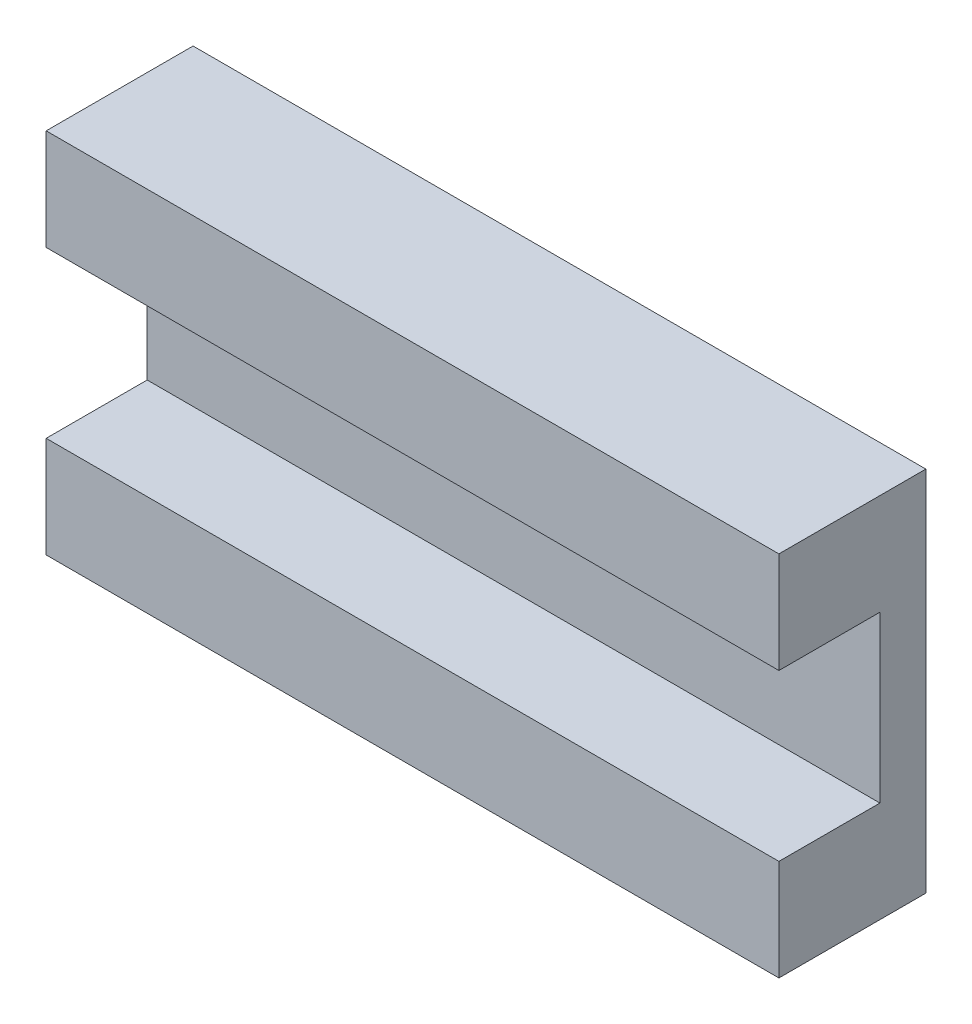
ISO-10303-21;
HEADER;
FILE_DESCRIPTION(('STEP AP214'),'2;1');
FILE_NAME('part.step','',(''),(''),'','','');
FILE_SCHEMA(('AUTOMOTIVE_DESIGN { 1 0 10303 214 1 1 1 1 }'));
ENDSEC;
DATA;
#1=APPLICATION_CONTEXT('core data for automotive mechanical design processes');
#2=APPLICATION_PROTOCOL_DEFINITION('international standard','automotive_design',2000,#1);
#3=PRODUCT_CONTEXT('',#1,'mechanical');
#4=PRODUCT('Part','Part','',(#3));
#5=PRODUCT_RELATED_PRODUCT_CATEGORY('part','',(#4));
#6=PRODUCT_DEFINITION_FORMATION('','',#4);
#7=PRODUCT_DEFINITION_CONTEXT('part definition',#1,'design');
#8=PRODUCT_DEFINITION('design','',#6,#7);
#9=PRODUCT_DEFINITION_SHAPE('','',#8);
#10=(LENGTH_UNIT() NAMED_UNIT(*) SI_UNIT(.MILLI.,.METRE.));
#11=(NAMED_UNIT(*) PLANE_ANGLE_UNIT() SI_UNIT($,.RADIAN.));
#12=(NAMED_UNIT(*) SI_UNIT($,.STERADIAN.) SOLID_ANGLE_UNIT());
#13=UNCERTAINTY_MEASURE_WITH_UNIT(LENGTH_MEASURE(1.E-05),#10,'distance_accuracy_value','');
#14=(GEOMETRIC_REPRESENTATION_CONTEXT(3) GLOBAL_UNCERTAINTY_ASSIGNED_CONTEXT((#13)) GLOBAL_UNIT_ASSIGNED_CONTEXT((#10,
#11,#12)) REPRESENTATION_CONTEXT('',''));
#15=CARTESIAN_POINT('',(0.,0.,0.));
#16=DIRECTION('',(0.,0.,1.));
#17=DIRECTION('',(1.,0.,0.));
#18=AXIS2_PLACEMENT_3D('',#15,#16,#17);
#19=CARTESIAN_POINT('',(0.,0.,8.));
#20=DIRECTION('',(0.,0.,1.));
#21=DIRECTION('',(1.,0.,0.));
#22=AXIS2_PLACEMENT_3D('',#19,#20,#21);
#23=PLANE('',#22);
#24=DIRECTION('',(1.,0.,0.));
#25=VECTOR('',#24,1.);
#26=CARTESIAN_POINT('',(-39.9,14.5,8.));
#27=LINE('',#26,#25);
#28=CARTESIAN_POINT('',(-39.9,14.5,8.));
#29=VERTEX_POINT('',#28);
#30=CARTESIAN_POINT('',(0.,14.5,8.));
#31=VERTEX_POINT('',#30);
#32=EDGE_CURVE('E137',#29,#31,#27,.T.);
#33=ORIENTED_EDGE('',*,*,#32,.T.);
#34=DIRECTION('',(0.,1.,0.));
#35=VECTOR('',#34,1.);
#36=CARTESIAN_POINT('',(0.,0.,8.));
#37=LINE('',#36,#35);
#38=CARTESIAN_POINT('',(0.,20.,8.));
#39=VERTEX_POINT('',#38);
#40=EDGE_CURVE('E85',#31,#39,#37,.T.);
#41=ORIENTED_EDGE('',*,*,#40,.T.);
#42=DIRECTION('',(-1.,0.,0.));
#43=VECTOR('',#42,1.);
#44=CARTESIAN_POINT('',(0.,20.,8.));
#45=LINE('',#44,#43);
#46=CARTESIAN_POINT('',(-39.9,20.,8.));
#47=VERTEX_POINT('',#46);
#48=EDGE_CURVE('E168',#39,#47,#45,.T.);
#49=ORIENTED_EDGE('',*,*,#48,.T.);
#50=DIRECTION('',(0.,-1.,0.));
#51=VECTOR('',#50,1.);
#52=CARTESIAN_POINT('',(-39.9,0.,8.));
#53=LINE('',#52,#51);
#54=EDGE_CURVE('E170',#47,#29,#53,.T.);
#55=ORIENTED_EDGE('',*,*,#54,.T.);
#56=EDGE_LOOP('',(#33,#41,#49,#55));
#57=FACE_BOUND('',#56,.T.);
#58=ADVANCED_FACE('F32',(#57),#23,.T.);
#59=CARTESIAN_POINT('',(0.,0.,8.));
#60=DIRECTION('',(-1.,0.,0.));
#61=DIRECTION('',(0.,0.,1.));
#62=AXIS2_PLACEMENT_3D('',#59,#60,#61);
#63=PLANE('',#62);
#64=ORIENTED_EDGE('',*,*,#40,.F.);
#65=DIRECTION('',(0.,0.,1.));
#66=VECTOR('',#65,1.);
#67=CARTESIAN_POINT('',(0.,14.5,8.));
#68=LINE('',#67,#66);
#69=CARTESIAN_POINT('',(0.,14.5,2.5));
#70=VERTEX_POINT('',#69);
#71=EDGE_CURVE('E129',#70,#31,#68,.T.);
#72=ORIENTED_EDGE('',*,*,#71,.F.);
#73=DIRECTION('',(0.,1.,0.));
#74=VECTOR('',#73,1.);
#75=CARTESIAN_POINT('',(0.,14.5,2.5));
#76=LINE('',#75,#74);
#77=CARTESIAN_POINT('',(0.,5.5,2.5));
#78=VERTEX_POINT('',#77);
#79=EDGE_CURVE('E131',#78,#70,#76,.T.);
#80=ORIENTED_EDGE('',*,*,#79,.F.);
#81=DIRECTION('',(0.,0.,-1.));
#82=VECTOR('',#81,1.);
#83=CARTESIAN_POINT('',(0.,5.5,8.));
#84=LINE('',#83,#82);
#85=CARTESIAN_POINT('',(0.,5.5,8.));
#86=VERTEX_POINT('',#85);
#87=EDGE_CURVE('E110',#86,#78,#84,.T.);
#88=ORIENTED_EDGE('',*,*,#87,.F.);
#89=CARTESIAN_POINT('',(0.,0.,8.));
#90=VERTEX_POINT('',#89);
#91=EDGE_CURVE('E166',#90,#86,#37,.T.);
#92=ORIENTED_EDGE('',*,*,#91,.F.);
#93=DIRECTION('',(0.,0.,-1.));
#94=VECTOR('',#93,1.);
#95=CARTESIAN_POINT('',(0.,0.,8.));
#96=LINE('',#95,#94);
#97=CARTESIAN_POINT('',(0.,0.,0.));
#98=VERTEX_POINT('',#97);
#99=EDGE_CURVE('E174',#90,#98,#96,.T.);
#100=ORIENTED_EDGE('',*,*,#99,.T.);
#101=DIRECTION('',(0.,1.,0.));
#102=VECTOR('',#101,1.);
#103=CARTESIAN_POINT('',(0.,0.,0.));
#104=LINE('',#103,#102);
#105=CARTESIAN_POINT('',(0.,20.,0.));
#106=VERTEX_POINT('',#105);
#107=EDGE_CURVE('E163',#98,#106,#104,.T.);
#108=ORIENTED_EDGE('',*,*,#107,.T.);
#109=DIRECTION('',(0.,0.,-1.));
#110=VECTOR('',#109,1.);
#111=CARTESIAN_POINT('',(0.,20.,8.));
#112=LINE('',#111,#110);
#113=EDGE_CURVE('E11',#39,#106,#112,.T.);
#114=ORIENTED_EDGE('',*,*,#113,.F.);
#115=EDGE_LOOP('',(#64,#72,#80,#88,#92,#100,#108,#114));
#116=FACE_BOUND('',#115,.T.);
#117=ADVANCED_FACE('F34',(#116),#63,.F.);
#118=CARTESIAN_POINT('',(0.,20.,8.));
#119=DIRECTION('',(0.,-1.,0.));
#120=DIRECTION('',(1.,0.,0.));
#121=AXIS2_PLACEMENT_3D('',#118,#119,#120);
#122=PLANE('',#121);
#123=DIRECTION('',(-1.,0.,0.));
#124=VECTOR('',#123,1.);
#125=CARTESIAN_POINT('',(0.,20.,0.));
#126=LINE('',#125,#124);
#127=CARTESIAN_POINT('',(-39.9,20.,0.));
#128=VERTEX_POINT('',#127);
#129=EDGE_CURVE('E177',#106,#128,#126,.T.);
#130=ORIENTED_EDGE('',*,*,#129,.T.);
#131=DIRECTION('',(0.,0.,-1.));
#132=VECTOR('',#131,1.);
#133=CARTESIAN_POINT('',(-39.9,20.,8.));
#134=LINE('',#133,#132);
#135=EDGE_CURVE('E40',#47,#128,#134,.T.);
#136=ORIENTED_EDGE('',*,*,#135,.F.);
#137=ORIENTED_EDGE('',*,*,#48,.F.);
#138=ORIENTED_EDGE('',*,*,#113,.T.);
#139=EDGE_LOOP('',(#130,#136,#137,#138));
#140=FACE_BOUND('',#139,.T.);
#141=ADVANCED_FACE('F204',(#140),#122,.F.);
#142=CARTESIAN_POINT('',(-39.9,0.,8.));
#143=DIRECTION('',(1.,0.,0.));
#144=DIRECTION('',(0.,0.,-1.));
#145=AXIS2_PLACEMENT_3D('',#142,#143,#144);
#146=PLANE('',#145);
#147=DIRECTION('',(0.,1.,0.));
#148=VECTOR('',#147,1.);
#149=CARTESIAN_POINT('',(-39.9,14.5,2.5));
#150=LINE('',#149,#148);
#151=CARTESIAN_POINT('',(-39.9,5.5,2.5));
#152=VERTEX_POINT('',#151);
#153=CARTESIAN_POINT('',(-39.9,14.5,2.5));
#154=VERTEX_POINT('',#153);
#155=EDGE_CURVE('E118',#152,#154,#150,.T.);
#156=ORIENTED_EDGE('',*,*,#155,.T.);
#157=DIRECTION('',(0.,0.,1.));
#158=VECTOR('',#157,1.);
#159=CARTESIAN_POINT('',(-39.9,14.5,8.));
#160=LINE('',#159,#158);
#161=EDGE_CURVE('E123',#154,#29,#160,.T.);
#162=ORIENTED_EDGE('',*,*,#161,.T.);
#163=ORIENTED_EDGE('',*,*,#54,.F.);
#164=ORIENTED_EDGE('',*,*,#135,.T.);
#165=DIRECTION('',(0.,-1.,0.));
#166=VECTOR('',#165,1.);
#167=CARTESIAN_POINT('',(-39.9,0.,0.));
#168=LINE('',#167,#166);
#169=CARTESIAN_POINT('',(-39.9,0.,0.));
#170=VERTEX_POINT('',#169);
#171=EDGE_CURVE('E179',#128,#170,#168,.T.);
#172=ORIENTED_EDGE('',*,*,#171,.T.);
#173=DIRECTION('',(0.,0.,-1.));
#174=VECTOR('',#173,1.);
#175=CARTESIAN_POINT('',(-39.9,0.,8.));
#176=LINE('',#175,#174);
#177=CARTESIAN_POINT('',(-39.9,0.,8.));
#178=VERTEX_POINT('',#177);
#179=EDGE_CURVE('E183',#178,#170,#176,.T.);
#180=ORIENTED_EDGE('',*,*,#179,.F.);
#181=CARTESIAN_POINT('',(-39.9,5.5,8.));
#182=VERTEX_POINT('',#181);
#183=EDGE_CURVE('E128',#182,#178,#53,.T.);
#184=ORIENTED_EDGE('',*,*,#183,.F.);
#185=DIRECTION('',(0.,0.,-1.));
#186=VECTOR('',#185,1.);
#187=CARTESIAN_POINT('',(-39.9,5.5,8.));
#188=LINE('',#187,#186);
#189=EDGE_CURVE('E47',#182,#152,#188,.T.);
#190=ORIENTED_EDGE('',*,*,#189,.T.);
#191=EDGE_LOOP('',(#156,#162,#163,#164,#172,#180,#184,#190));
#192=FACE_BOUND('',#191,.T.);
#193=ADVANCED_FACE('F126',(#192),#146,.F.);
#194=CARTESIAN_POINT('',(0.,0.,8.));
#195=DIRECTION('',(0.,1.,0.));
#196=DIRECTION('',(-1.,0.,0.));
#197=AXIS2_PLACEMENT_3D('',#194,#195,#196);
#198=PLANE('',#197);
#199=DIRECTION('',(1.,0.,0.));
#200=VECTOR('',#199,1.);
#201=CARTESIAN_POINT('',(0.,0.,0.));
#202=LINE('',#201,#200);
#203=EDGE_CURVE('E77',#170,#98,#202,.T.);
#204=ORIENTED_EDGE('',*,*,#203,.T.);
#205=ORIENTED_EDGE('',*,*,#99,.F.);
#206=DIRECTION('',(1.,0.,0.));
#207=VECTOR('',#206,1.);
#208=CARTESIAN_POINT('',(0.,0.,8.));
#209=LINE('',#208,#207);
#210=EDGE_CURVE('E56',#178,#90,#209,.T.);
#211=ORIENTED_EDGE('',*,*,#210,.F.);
#212=ORIENTED_EDGE('',*,*,#179,.T.);
#213=EDGE_LOOP('',(#204,#205,#211,#212));
#214=FACE_BOUND('',#213,.T.);
#215=ADVANCED_FACE('F195',(#214),#198,.F.);
#216=DIRECTION('',(1.,0.,0.));
#217=VECTOR('',#216,1.);
#218=CARTESIAN_POINT('',(-39.9,5.5,8.));
#219=LINE('',#218,#217);
#220=EDGE_CURVE('E115',#182,#86,#219,.T.);
#221=ORIENTED_EDGE('',*,*,#220,.F.);
#222=ORIENTED_EDGE('',*,*,#183,.T.);
#223=ORIENTED_EDGE('',*,*,#210,.T.);
#224=ORIENTED_EDGE('',*,*,#91,.T.);
#225=EDGE_LOOP('',(#221,#222,#223,#224));
#226=FACE_BOUND('',#225,.T.);
#227=ADVANCED_FACE('F197',(#226),#23,.T.);
#228=CARTESIAN_POINT('',(0.,0.,0.));
#229=DIRECTION('',(0.,0.,1.));
#230=DIRECTION('',(1.,0.,0.));
#231=AXIS2_PLACEMENT_3D('',#228,#229,#230);
#232=PLANE('',#231);
#233=CARTESIAN_POINT('',(-11.95,2.5,0.));
#234=DIRECTION('',(0.,0.,-1.));
#235=DIRECTION('',(1.,0.,0.));
#236=AXIS2_PLACEMENT_3D('',#233,#234,#235);
#237=CIRCLE('',#236,1.5);
#238=CARTESIAN_POINT('',(-10.45,2.5,0.));
#239=VERTEX_POINT('',#238);
#240=EDGE_CURVE('E139',#239,#239,#237,.T.);
#241=ORIENTED_EDGE('',*,*,#240,.F.);
#242=EDGE_LOOP('',(#241));
#243=FACE_BOUND('',#242,.T.);
#244=CARTESIAN_POINT('',(-27.95,2.5,0.));
#245=DIRECTION('',(0.,0.,-1.));
#246=DIRECTION('',(1.,0.,0.));
#247=AXIS2_PLACEMENT_3D('',#244,#245,#246);
#248=CIRCLE('',#247,1.5);
#249=CARTESIAN_POINT('',(-26.45,2.5,0.));
#250=VERTEX_POINT('',#249);
#251=EDGE_CURVE('E152',#250,#250,#248,.T.);
#252=ORIENTED_EDGE('',*,*,#251,.F.);
#253=EDGE_LOOP('',(#252));
#254=FACE_BOUND('',#253,.T.);
#255=CARTESIAN_POINT('',(-27.95,17.5,0.));
#256=DIRECTION('',(0.,0.,-1.));
#257=DIRECTION('',(-1.,0.,0.));
#258=AXIS2_PLACEMENT_3D('',#255,#256,#257);
#259=CIRCLE('',#258,1.5);
#260=CARTESIAN_POINT('',(-29.45,17.5,0.));
#261=VERTEX_POINT('',#260);
#262=EDGE_CURVE('E146',#261,#261,#259,.T.);
#263=ORIENTED_EDGE('',*,*,#262,.F.);
#264=EDGE_LOOP('',(#263));
#265=FACE_BOUND('',#264,.T.);
#266=CARTESIAN_POINT('',(-11.95,17.5,0.));
#267=DIRECTION('',(0.,0.,-1.));
#268=DIRECTION('',(-1.,0.,0.));
#269=AXIS2_PLACEMENT_3D('',#266,#267,#268);
#270=CIRCLE('',#269,1.5);
#271=CARTESIAN_POINT('',(-13.45,17.5,0.));
#272=VERTEX_POINT('',#271);
#273=EDGE_CURVE('E145',#272,#272,#270,.T.);
#274=ORIENTED_EDGE('',*,*,#273,.F.);
#275=EDGE_LOOP('',(#274));
#276=FACE_BOUND('',#275,.T.);
#277=ORIENTED_EDGE('',*,*,#107,.F.);
#278=ORIENTED_EDGE('',*,*,#203,.F.);
#279=ORIENTED_EDGE('',*,*,#171,.F.);
#280=ORIENTED_EDGE('',*,*,#129,.F.);
#281=EDGE_LOOP('',(#277,#278,#279,#280));
#282=FACE_BOUND('',#281,.T.);
#283=ADVANCED_FACE('F191',(#243,#254,#265,#276,#282),#232,.F.);
#284=CARTESIAN_POINT('',(-11.95,17.5,3.));
#285=DIRECTION('',(0.,0.,-1.));
#286=DIRECTION('',(-1.,0.,0.));
#287=AXIS2_PLACEMENT_3D('',#284,#285,#286);
#288=CYLINDRICAL_SURFACE('',#287,1.5);
#289=CARTESIAN_POINT('',(-11.95,17.5,3.));
#290=DIRECTION('',(0.,0.,-1.));
#291=DIRECTION('',(-1.,0.,0.));
#292=AXIS2_PLACEMENT_3D('',#289,#290,#291);
#293=CIRCLE('',#292,1.5);
#294=CARTESIAN_POINT('',(-13.45,17.5,3.));
#295=VERTEX_POINT('',#294);
#296=EDGE_CURVE('E160',#295,#295,#293,.T.);
#297=ORIENTED_EDGE('',*,*,#296,.F.);
#298=EDGE_LOOP('',(#297));
#299=FACE_BOUND('',#298,.T.);
#300=ORIENTED_EDGE('',*,*,#273,.T.);
#301=EDGE_LOOP('',(#300));
#302=FACE_BOUND('',#301,.T.);
#303=ADVANCED_FACE('F212',(#299,#302),#288,.F.);
#304=CARTESIAN_POINT('',(-11.95,17.5,3.));
#305=DIRECTION('',(0.,0.,-1.));
#306=DIRECTION('',(-1.,0.,0.));
#307=AXIS2_PLACEMENT_3D('',#304,#305,#306);
#308=PLANE('',#307);
#309=ORIENTED_EDGE('',*,*,#296,.T.);
#310=EDGE_LOOP('',(#309));
#311=FACE_BOUND('',#310,.T.);
#312=ADVANCED_FACE('F219',(#311),#308,.T.);
#313=CARTESIAN_POINT('',(-27.95,17.5,3.));
#314=DIRECTION('',(0.,0.,-1.));
#315=DIRECTION('',(-1.,0.,0.));
#316=AXIS2_PLACEMENT_3D('',#313,#314,#315);
#317=CYLINDRICAL_SURFACE('',#316,1.5);
#318=CARTESIAN_POINT('',(-27.95,17.5,3.));
#319=DIRECTION('',(0.,0.,-1.));
#320=DIRECTION('',(-1.,0.,0.));
#321=AXIS2_PLACEMENT_3D('',#318,#319,#320);
#322=CIRCLE('',#321,1.5);
#323=CARTESIAN_POINT('',(-29.45,17.5,3.));
#324=VERTEX_POINT('',#323);
#325=EDGE_CURVE('E142',#324,#324,#322,.T.);
#326=ORIENTED_EDGE('',*,*,#325,.F.);
#327=EDGE_LOOP('',(#326));
#328=FACE_BOUND('',#327,.T.);
#329=ORIENTED_EDGE('',*,*,#262,.T.);
#330=EDGE_LOOP('',(#329));
#331=FACE_BOUND('',#330,.T.);
#332=ADVANCED_FACE('F230',(#328,#331),#317,.F.);
#333=CARTESIAN_POINT('',(-27.95,17.5,3.));
#334=DIRECTION('',(0.,0.,-1.));
#335=DIRECTION('',(-1.,0.,0.));
#336=AXIS2_PLACEMENT_3D('',#333,#334,#335);
#337=PLANE('',#336);
#338=ORIENTED_EDGE('',*,*,#325,.T.);
#339=EDGE_LOOP('',(#338));
#340=FACE_BOUND('',#339,.T.);
#341=ADVANCED_FACE('F232',(#340),#337,.T.);
#342=CARTESIAN_POINT('',(-27.95,2.5,3.));
#343=DIRECTION('',(0.,0.,-1.));
#344=DIRECTION('',(-1.,0.,0.));
#345=AXIS2_PLACEMENT_3D('',#342,#343,#344);
#346=CYLINDRICAL_SURFACE('',#345,1.5);
#347=CARTESIAN_POINT('',(-27.95,2.5,3.));
#348=DIRECTION('',(0.,0.,-1.));
#349=DIRECTION('',(1.,0.,0.));
#350=AXIS2_PLACEMENT_3D('',#347,#348,#349);
#351=CIRCLE('',#350,1.5);
#352=CARTESIAN_POINT('',(-26.45,2.5,3.));
#353=VERTEX_POINT('',#352);
#354=EDGE_CURVE('E149',#353,#353,#351,.T.);
#355=ORIENTED_EDGE('',*,*,#354,.F.);
#356=EDGE_LOOP('',(#355));
#357=FACE_BOUND('',#356,.T.);
#358=ORIENTED_EDGE('',*,*,#251,.T.);
#359=EDGE_LOOP('',(#358));
#360=FACE_BOUND('',#359,.T.);
#361=ADVANCED_FACE('F239',(#357,#360),#346,.F.);
#362=CARTESIAN_POINT('',(-27.95,2.5,3.));
#363=DIRECTION('',(0.,0.,1.));
#364=DIRECTION('',(1.,0.,0.));
#365=AXIS2_PLACEMENT_3D('',#362,#363,#364);
#366=PLANE('',#365);
#367=ORIENTED_EDGE('',*,*,#354,.T.);
#368=EDGE_LOOP('',(#367));
#369=FACE_BOUND('',#368,.T.);
#370=ADVANCED_FACE('F246',(#369),#366,.F.);
#371=CARTESIAN_POINT('',(-11.95,2.5,3.));
#372=DIRECTION('',(0.,0.,-1.));
#373=DIRECTION('',(-1.,0.,0.));
#374=AXIS2_PLACEMENT_3D('',#371,#372,#373);
#375=CYLINDRICAL_SURFACE('',#374,1.5);
#376=CARTESIAN_POINT('',(-11.95,2.5,3.));
#377=DIRECTION('',(0.,0.,-1.));
#378=DIRECTION('',(1.,0.,0.));
#379=AXIS2_PLACEMENT_3D('',#376,#377,#378);
#380=CIRCLE('',#379,1.5);
#381=CARTESIAN_POINT('',(-10.45,2.5,3.));
#382=VERTEX_POINT('',#381);
#383=EDGE_CURVE('E155',#382,#382,#380,.T.);
#384=ORIENTED_EDGE('',*,*,#383,.F.);
#385=EDGE_LOOP('',(#384));
#386=FACE_BOUND('',#385,.T.);
#387=ORIENTED_EDGE('',*,*,#240,.T.);
#388=EDGE_LOOP('',(#387));
#389=FACE_BOUND('',#388,.T.);
#390=ADVANCED_FACE('F249',(#386,#389),#375,.F.);
#391=CARTESIAN_POINT('',(-11.95,2.5,3.));
#392=DIRECTION('',(0.,0.,1.));
#393=DIRECTION('',(1.,0.,0.));
#394=AXIS2_PLACEMENT_3D('',#391,#392,#393);
#395=PLANE('',#394);
#396=ORIENTED_EDGE('',*,*,#383,.T.);
#397=EDGE_LOOP('',(#396));
#398=FACE_BOUND('',#397,.T.);
#399=ADVANCED_FACE('F254',(#398),#395,.F.);
#400=CARTESIAN_POINT('',(-39.9,14.5,8.));
#401=DIRECTION('',(0.,1.,0.));
#402=DIRECTION('',(0.,0.,1.));
#403=AXIS2_PLACEMENT_3D('',#400,#401,#402);
#404=PLANE('',#403);
#405=ORIENTED_EDGE('',*,*,#71,.T.);
#406=ORIENTED_EDGE('',*,*,#32,.F.);
#407=ORIENTED_EDGE('',*,*,#161,.F.);
#408=DIRECTION('',(1.,0.,0.));
#409=VECTOR('',#408,1.);
#410=CARTESIAN_POINT('',(-39.9,14.5,2.5));
#411=LINE('',#410,#409);
#412=EDGE_CURVE('E114',#154,#70,#411,.T.);
#413=ORIENTED_EDGE('',*,*,#412,.T.);
#414=EDGE_LOOP('',(#405,#406,#407,#413));
#415=FACE_BOUND('',#414,.T.);
#416=ADVANCED_FACE('F257',(#415),#404,.F.);
#417=CARTESIAN_POINT('',(-39.9,14.5,2.5));
#418=DIRECTION('',(0.,0.,-1.));
#419=DIRECTION('',(0.,1.,0.));
#420=AXIS2_PLACEMENT_3D('',#417,#418,#419);
#421=PLANE('',#420);
#422=ORIENTED_EDGE('',*,*,#79,.T.);
#423=ORIENTED_EDGE('',*,*,#412,.F.);
#424=ORIENTED_EDGE('',*,*,#155,.F.);
#425=DIRECTION('',(1.,0.,0.));
#426=VECTOR('',#425,1.);
#427=CARTESIAN_POINT('',(-39.9,5.5,2.5));
#428=LINE('',#427,#426);
#429=EDGE_CURVE('E106',#152,#78,#428,.T.);
#430=ORIENTED_EDGE('',*,*,#429,.T.);
#431=EDGE_LOOP('',(#422,#423,#424,#430));
#432=FACE_BOUND('',#431,.T.);
#433=ADVANCED_FACE('F119',(#432),#421,.F.);
#434=CARTESIAN_POINT('',(-39.9,5.5,8.));
#435=DIRECTION('',(0.,-1.,0.));
#436=DIRECTION('',(0.,0.,-1.));
#437=AXIS2_PLACEMENT_3D('',#434,#435,#436);
#438=PLANE('',#437);
#439=ORIENTED_EDGE('',*,*,#87,.T.);
#440=ORIENTED_EDGE('',*,*,#429,.F.);
#441=ORIENTED_EDGE('',*,*,#189,.F.);
#442=ORIENTED_EDGE('',*,*,#220,.T.);
#443=EDGE_LOOP('',(#439,#440,#441,#442));
#444=FACE_BOUND('',#443,.T.);
#445=ADVANCED_FACE('F108',(#444),#438,.F.);
#446=CLOSED_SHELL('',(#58,#117,#141,#193,#215,#227,#283,#303,#312,#332,#341,#361,#370,#390,#399,
#416,#433,#445));
#447=MANIFOLD_SOLID_BREP('B2',#446);
#448=ADVANCED_BREP_SHAPE_REPRESENTATION('',(#18,#447),#14);
#449=SHAPE_DEFINITION_REPRESENTATION(#9,#448);
ENDSEC;
END-ISO-10303-21;
